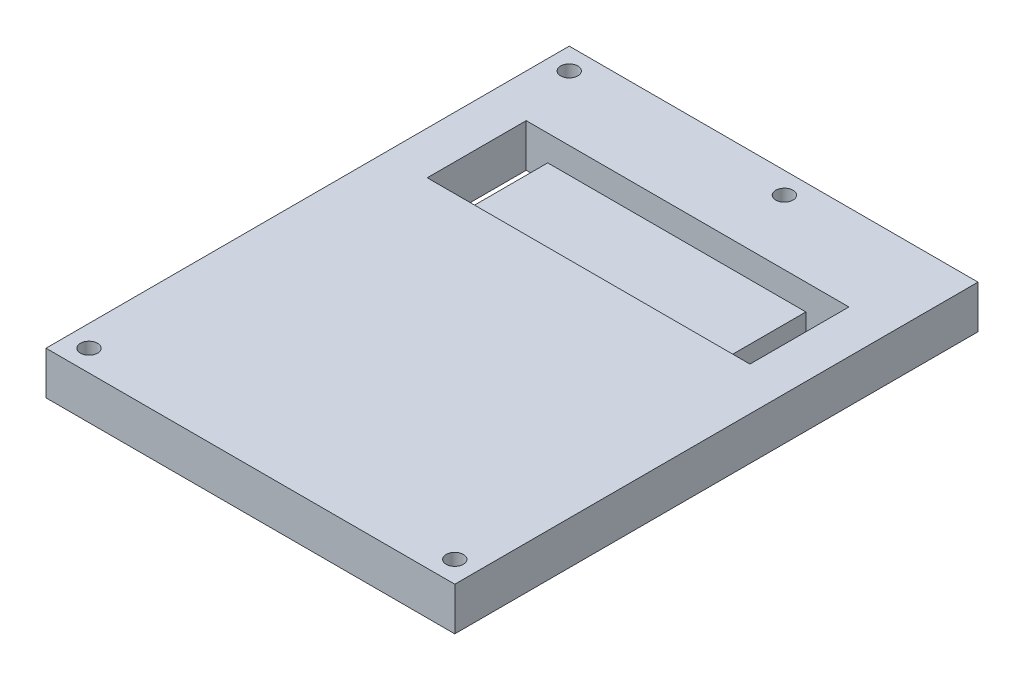
ISO-10303-21;
HEADER;
FILE_DESCRIPTION(('STEP AP214'),'2;1');
FILE_NAME('part.step','',(''),(''),'','','');
FILE_SCHEMA(('AUTOMOTIVE_DESIGN { 1 0 10303 214 1 1 1 1 }'));
ENDSEC;
DATA;
#1=APPLICATION_CONTEXT('core data for automotive mechanical design processes');
#2=APPLICATION_PROTOCOL_DEFINITION('international standard','automotive_design',2000,#1);
#3=PRODUCT_CONTEXT('',#1,'mechanical');
#4=PRODUCT('Part','Part','',(#3));
#5=PRODUCT_RELATED_PRODUCT_CATEGORY('part','',(#4));
#6=PRODUCT_DEFINITION_FORMATION('','',#4);
#7=PRODUCT_DEFINITION_CONTEXT('part definition',#1,'design');
#8=PRODUCT_DEFINITION('design','',#6,#7);
#9=PRODUCT_DEFINITION_SHAPE('','',#8);
#10=(LENGTH_UNIT() NAMED_UNIT(*) SI_UNIT(.MILLI.,.METRE.));
#11=(NAMED_UNIT(*) PLANE_ANGLE_UNIT() SI_UNIT($,.RADIAN.));
#12=(NAMED_UNIT(*) SI_UNIT($,.STERADIAN.) SOLID_ANGLE_UNIT());
#13=UNCERTAINTY_MEASURE_WITH_UNIT(LENGTH_MEASURE(1.E-05),#10,'distance_accuracy_value','');
#14=(GEOMETRIC_REPRESENTATION_CONTEXT(3) GLOBAL_UNCERTAINTY_ASSIGNED_CONTEXT((#13)) GLOBAL_UNIT_ASSIGNED_CONTEXT((#10,
#11,#12)) REPRESENTATION_CONTEXT('',''));
#15=CARTESIAN_POINT('',(0.,0.,0.));
#16=DIRECTION('',(0.,0.,1.));
#17=DIRECTION('',(1.,0.,0.));
#18=AXIS2_PLACEMENT_3D('',#15,#16,#17);
#19=CARTESIAN_POINT('',(0.,-3.,0.));
#20=DIRECTION('',(0.,-1.,0.));
#21=DIRECTION('',(0.,0.,-1.));
#22=AXIS2_PLACEMENT_3D('',#19,#20,#21);
#23=PLANE('',#22);
#24=DIRECTION('',(0.,0.,-1.));
#25=VECTOR('',#24,1.);
#26=CARTESIAN_POINT('',(-46.9052863436124,-3.,-23.3382371267091));
#27=LINE('',#26,#25);
#28=CARTESIAN_POINT('',(-46.9052863436124,-3.,-11.8382371267091));
#29=VERTEX_POINT('',#28);
#30=CARTESIAN_POINT('',(-46.9052863436124,-3.,-23.3382371267091));
#31=VERTEX_POINT('',#30);
#32=EDGE_CURVE('E161',#29,#31,#27,.T.);
#33=ORIENTED_EDGE('',*,*,#32,.F.);
#34=DIRECTION('',(1.,0.,0.));
#35=VECTOR('',#34,1.);
#36=CARTESIAN_POINT('',(-49.4052863436124,-3.,-11.8382371267091));
#37=LINE('',#36,#35);
#38=CARTESIAN_POINT('',(-16.9052863436124,-3.,-11.8382371267091));
#39=VERTEX_POINT('',#38);
#40=EDGE_CURVE('E208',#29,#39,#37,.T.);
#41=ORIENTED_EDGE('',*,*,#40,.T.);
#42=DIRECTION('',(0.,0.,1.));
#43=VECTOR('',#42,1.);
#44=CARTESIAN_POINT('',(-16.9052863436124,-3.,-23.3382371267091));
#45=LINE('',#44,#43);
#46=CARTESIAN_POINT('',(-16.9052863436124,-3.,-23.3382371267091));
#47=VERTEX_POINT('',#46);
#48=EDGE_CURVE('E185',#47,#39,#45,.T.);
#49=ORIENTED_EDGE('',*,*,#48,.F.);
#50=DIRECTION('',(1.,0.,0.));
#51=VECTOR('',#50,1.);
#52=CARTESIAN_POINT('',(-49.4052863436124,-3.,-23.3382371267091));
#53=LINE('',#52,#51);
#54=EDGE_CURVE('E204',#31,#47,#53,.T.);
#55=ORIENTED_EDGE('',*,*,#54,.F.);
#56=EDGE_LOOP('',(#33,#41,#49,#55));
#57=FACE_BOUND('',#56,.T.);
#58=ADVANCED_FACE('F39',(#57),#23,.F.);
#59=CARTESIAN_POINT('',(0.,0.,0.));
#60=DIRECTION('',(0.,-1.,0.));
#61=DIRECTION('',(0.,0.,-1.));
#62=AXIS2_PLACEMENT_3D('',#59,#60,#61);
#63=PLANE('',#62);
#64=CARTESIAN_POINT('',(-9.40528634361236,0.,24.9617628732909));
#65=DIRECTION('',(0.,1.,0.));
#66=DIRECTION('',(0.,0.,1.));
#67=AXIS2_PLACEMENT_3D('',#64,#65,#66);
#68=CIRCLE('',#67,1.);
#69=CARTESIAN_POINT('',(-9.40528634361236,0.,25.9617628732909));
#70=VERTEX_POINT('',#69);
#71=EDGE_CURVE('E462',#70,#70,#68,.T.);
#72=ORIENTED_EDGE('',*,*,#71,.F.);
#73=EDGE_LOOP('',(#72));
#74=FACE_BOUND('',#73,.T.);
#75=CARTESIAN_POINT('',(-51.9052863436124,0.,24.9617628732909));
#76=DIRECTION('',(0.,1.,0.));
#77=DIRECTION('',(0.,0.,1.));
#78=AXIS2_PLACEMENT_3D('',#75,#76,#77);
#79=CIRCLE('',#78,0.999999999999998);
#80=CARTESIAN_POINT('',(-51.9052863436124,0.,25.9617628732909));
#81=VERTEX_POINT('',#80);
#82=EDGE_CURVE('E470',#81,#81,#79,.T.);
#83=ORIENTED_EDGE('',*,*,#82,.F.);
#84=EDGE_LOOP('',(#83));
#85=FACE_BOUND('',#84,.T.);
#86=CARTESIAN_POINT('',(-51.9052863436124,0.,-30.8382371267091));
#87=DIRECTION('',(0.,1.,0.));
#88=DIRECTION('',(0.,0.,1.));
#89=AXIS2_PLACEMENT_3D('',#86,#87,#88);
#90=CIRCLE('',#89,0.999999999999998);
#91=CARTESIAN_POINT('',(-51.9052863436124,0.,-29.8382371267091));
#92=VERTEX_POINT('',#91);
#93=EDGE_CURVE('E480',#92,#92,#90,.T.);
#94=ORIENTED_EDGE('',*,*,#93,.F.);
#95=EDGE_LOOP('',(#94));
#96=FACE_BOUND('',#95,.T.);
#97=CARTESIAN_POINT('',(-26.9052863436124,0.,-30.8382371267091));
#98=DIRECTION('',(0.,1.,0.));
#99=DIRECTION('',(0.,0.,1.));
#100=AXIS2_PLACEMENT_3D('',#97,#98,#99);
#101=CIRCLE('',#100,1.);
#102=CARTESIAN_POINT('',(-26.9052863436124,0.,-29.8382371267091));
#103=VERTEX_POINT('',#102);
#104=EDGE_CURVE('E167',#103,#103,#101,.T.);
#105=ORIENTED_EDGE('',*,*,#104,.F.);
#106=EDGE_LOOP('',(#105));
#107=FACE_BOUND('',#106,.T.);
#108=DIRECTION('',(1.,0.,0.));
#109=VECTOR('',#108,1.);
#110=CARTESIAN_POINT('',(-54.4052863436124,0.,-33.3382371267091));
#111=LINE('',#110,#109);
#112=CARTESIAN_POINT('',(-54.4052863436124,0.,-33.3382371267091));
#113=VERTEX_POINT('',#112);
#114=CARTESIAN_POINT('',(-6.90528634361236,0.,-33.3382371267091));
#115=VERTEX_POINT('',#114);
#116=EDGE_CURVE('E232',#113,#115,#111,.T.);
#117=ORIENTED_EDGE('',*,*,#116,.F.);
#118=DIRECTION('',(0.,0.,1.));
#119=VECTOR('',#118,1.);
#120=CARTESIAN_POINT('',(-54.4052863436124,0.,-33.3382371267091));
#121=LINE('',#120,#119);
#122=CARTESIAN_POINT('',(-54.4052863436124,0.,27.4617628732909));
#123=VERTEX_POINT('',#122);
#124=EDGE_CURVE('E238',#113,#123,#121,.T.);
#125=ORIENTED_EDGE('',*,*,#124,.T.);
#126=DIRECTION('',(1.,0.,0.));
#127=VECTOR('',#126,1.);
#128=CARTESIAN_POINT('',(-54.4052863436124,0.,27.4617628732909));
#129=LINE('',#128,#127);
#130=CARTESIAN_POINT('',(-6.90528634361235,0.,27.4617628732909));
#131=VERTEX_POINT('',#130);
#132=EDGE_CURVE('E257',#123,#131,#129,.T.);
#133=ORIENTED_EDGE('',*,*,#132,.T.);
#134=DIRECTION('',(0.,0.,1.));
#135=VECTOR('',#134,1.);
#136=CARTESIAN_POINT('',(-6.90528634361236,0.,-33.3382371267091));
#137=LINE('',#136,#135);
#138=EDGE_CURVE('E253',#115,#131,#137,.T.);
#139=ORIENTED_EDGE('',*,*,#138,.F.);
#140=EDGE_LOOP('',(#117,#125,#133,#139));
#141=FACE_BOUND('',#140,.T.);
#142=DIRECTION('',(1.,0.,0.));
#143=VECTOR('',#142,1.);
#144=CARTESIAN_POINT('',(-49.4052863436124,0.,-23.3382371267091));
#145=LINE('',#144,#143);
#146=CARTESIAN_POINT('',(-49.4052863436124,0.,-23.3382371267091));
#147=VERTEX_POINT('',#146);
#148=CARTESIAN_POINT('',(-11.9052863436124,0.,-23.3382371267091));
#149=VERTEX_POINT('',#148);
#150=EDGE_CURVE('E177',#147,#149,#145,.T.);
#151=ORIENTED_EDGE('',*,*,#150,.T.);
#152=DIRECTION('',(0.,0.,1.));
#153=VECTOR('',#152,1.);
#154=CARTESIAN_POINT('',(-11.9052863436124,0.,-23.3382371267091));
#155=LINE('',#154,#153);
#156=CARTESIAN_POINT('',(-11.9052863436124,0.,-11.8382371267091));
#157=VERTEX_POINT('',#156);
#158=EDGE_CURVE('E215',#149,#157,#155,.T.);
#159=ORIENTED_EDGE('',*,*,#158,.T.);
#160=DIRECTION('',(1.,0.,0.));
#161=VECTOR('',#160,1.);
#162=CARTESIAN_POINT('',(-49.4052863436124,0.,-11.8382371267091));
#163=LINE('',#162,#161);
#164=CARTESIAN_POINT('',(-49.4052863436124,0.,-11.8382371267091));
#165=VERTEX_POINT('',#164);
#166=EDGE_CURVE('E219',#165,#157,#163,.T.);
#167=ORIENTED_EDGE('',*,*,#166,.F.);
#168=DIRECTION('',(0.,0.,1.));
#169=VECTOR('',#168,1.);
#170=CARTESIAN_POINT('',(-49.4052863436124,0.,-23.3382371267091));
#171=LINE('',#170,#169);
#172=EDGE_CURVE('E139',#147,#165,#171,.T.);
#173=ORIENTED_EDGE('',*,*,#172,.F.);
#174=EDGE_LOOP('',(#151,#159,#167,#173));
#175=FACE_BOUND('',#174,.T.);
#176=ADVANCED_FACE('F279',(#74,#85,#96,#107,#141,#175),#63,.F.);
#177=CARTESIAN_POINT('',(-54.4052863436124,-5.,-33.3382371267091));
#178=DIRECTION('',(0.,0.,1.));
#179=DIRECTION('',(1.,0.,0.));
#180=AXIS2_PLACEMENT_3D('',#177,#178,#179);
#181=PLANE('',#180);
#182=ORIENTED_EDGE('',*,*,#116,.T.);
#183=DIRECTION('',(0.,1.,0.));
#184=VECTOR('',#183,1.);
#185=CARTESIAN_POINT('',(-6.90528634361236,-5.,-33.3382371267091));
#186=LINE('',#185,#184);
#187=CARTESIAN_POINT('',(-6.90528634361236,-5.,-33.3382371267091));
#188=VERTEX_POINT('',#187);
#189=EDGE_CURVE('E11',#188,#115,#186,.T.);
#190=ORIENTED_EDGE('',*,*,#189,.F.);
#191=DIRECTION('',(1.,0.,0.));
#192=VECTOR('',#191,1.);
#193=CARTESIAN_POINT('',(-54.4052863436124,-5.,-33.3382371267091));
#194=LINE('',#193,#192);
#195=CARTESIAN_POINT('',(-54.4052863436124,-5.,-33.3382371267091));
#196=VERTEX_POINT('',#195);
#197=EDGE_CURVE('E233',#196,#188,#194,.T.);
#198=ORIENTED_EDGE('',*,*,#197,.F.);
#199=DIRECTION('',(0.,1.,0.));
#200=VECTOR('',#199,1.);
#201=CARTESIAN_POINT('',(-54.4052863436124,-5.,-33.3382371267091));
#202=LINE('',#201,#200);
#203=EDGE_CURVE('E249',#196,#113,#202,.T.);
#204=ORIENTED_EDGE('',*,*,#203,.T.);
#205=EDGE_LOOP('',(#182,#190,#198,#204));
#206=FACE_BOUND('',#205,.T.);
#207=ADVANCED_FACE('F41',(#206),#181,.F.);
#208=CARTESIAN_POINT('',(-6.90528634361236,-5.,-33.3382371267091));
#209=DIRECTION('',(-1.,0.,0.));
#210=DIRECTION('',(0.,0.,1.));
#211=AXIS2_PLACEMENT_3D('',#208,#209,#210);
#212=PLANE('',#211);
#213=ORIENTED_EDGE('',*,*,#138,.T.);
#214=DIRECTION('',(0.,1.,0.));
#215=VECTOR('',#214,1.);
#216=CARTESIAN_POINT('',(-6.90528634361235,-5.,27.4617628732909));
#217=LINE('',#216,#215);
#218=CARTESIAN_POINT('',(-6.90528634361235,-5.,27.4617628732909));
#219=VERTEX_POINT('',#218);
#220=EDGE_CURVE('E48',#219,#131,#217,.T.);
#221=ORIENTED_EDGE('',*,*,#220,.F.);
#222=DIRECTION('',(0.,0.,1.));
#223=VECTOR('',#222,1.);
#224=CARTESIAN_POINT('',(-6.90528634361236,-5.,-33.3382371267091));
#225=LINE('',#224,#223);
#226=EDGE_CURVE('E237',#188,#219,#225,.T.);
#227=ORIENTED_EDGE('',*,*,#226,.F.);
#228=ORIENTED_EDGE('',*,*,#189,.T.);
#229=EDGE_LOOP('',(#213,#221,#227,#228));
#230=FACE_BOUND('',#229,.T.);
#231=ADVANCED_FACE('F275',(#230),#212,.F.);
#232=CARTESIAN_POINT('',(-54.4052863436124,-5.,27.4617628732909));
#233=DIRECTION('',(0.,0.,1.));
#234=DIRECTION('',(1.,0.,0.));
#235=AXIS2_PLACEMENT_3D('',#232,#233,#234);
#236=PLANE('',#235);
#237=ORIENTED_EDGE('',*,*,#132,.F.);
#238=DIRECTION('',(0.,1.,0.));
#239=VECTOR('',#238,1.);
#240=CARTESIAN_POINT('',(-54.4052863436124,-5.,27.4617628732909));
#241=LINE('',#240,#239);
#242=CARTESIAN_POINT('',(-54.4052863436124,-5.,27.4617628732909));
#243=VERTEX_POINT('',#242);
#244=EDGE_CURVE('E266',#243,#123,#241,.T.);
#245=ORIENTED_EDGE('',*,*,#244,.F.);
#246=DIRECTION('',(1.,0.,0.));
#247=VECTOR('',#246,1.);
#248=CARTESIAN_POINT('',(-54.4052863436124,-5.,27.4617628732909));
#249=LINE('',#248,#247);
#250=EDGE_CURVE('E241',#243,#219,#249,.T.);
#251=ORIENTED_EDGE('',*,*,#250,.T.);
#252=ORIENTED_EDGE('',*,*,#220,.T.);
#253=EDGE_LOOP('',(#237,#245,#251,#252));
#254=FACE_BOUND('',#253,.T.);
#255=ADVANCED_FACE('F272',(#254),#236,.T.);
#256=CARTESIAN_POINT('',(-54.4052863436124,-5.,-33.3382371267091));
#257=DIRECTION('',(-1.,0.,0.));
#258=DIRECTION('',(0.,0.,1.));
#259=AXIS2_PLACEMENT_3D('',#256,#257,#258);
#260=PLANE('',#259);
#261=ORIENTED_EDGE('',*,*,#124,.F.);
#262=ORIENTED_EDGE('',*,*,#203,.F.);
#263=DIRECTION('',(0.,0.,1.));
#264=VECTOR('',#263,1.);
#265=CARTESIAN_POINT('',(-54.4052863436124,-5.,-33.3382371267091));
#266=LINE('',#265,#264);
#267=EDGE_CURVE('E245',#196,#243,#266,.T.);
#268=ORIENTED_EDGE('',*,*,#267,.T.);
#269=ORIENTED_EDGE('',*,*,#244,.T.);
#270=EDGE_LOOP('',(#261,#262,#268,#269));
#271=FACE_BOUND('',#270,.T.);
#272=ADVANCED_FACE('F283',(#271),#260,.T.);
#273=CARTESIAN_POINT('',(0.,-5.,0.));
#274=DIRECTION('',(0.,-1.,0.));
#275=DIRECTION('',(0.,0.,-1.));
#276=AXIS2_PLACEMENT_3D('',#273,#274,#275);
#277=PLANE('',#276);
#278=CARTESIAN_POINT('',(-9.40528634361236,-5.,24.9617628732909));
#279=DIRECTION('',(0.,1.,0.));
#280=DIRECTION('',(0.,0.,1.));
#281=AXIS2_PLACEMENT_3D('',#278,#279,#280);
#282=CIRCLE('',#281,1.);
#283=CARTESIAN_POINT('',(-9.40528634361236,-5.,25.9617628732909));
#284=VERTEX_POINT('',#283);
#285=EDGE_CURVE('E199',#284,#284,#282,.T.);
#286=ORIENTED_EDGE('',*,*,#285,.T.);
#287=EDGE_LOOP('',(#286));
#288=FACE_BOUND('',#287,.T.);
#289=CARTESIAN_POINT('',(-51.9052863436124,-5.,24.9617628732909));
#290=DIRECTION('',(0.,1.,0.));
#291=DIRECTION('',(0.,0.,1.));
#292=AXIS2_PLACEMENT_3D('',#289,#290,#291);
#293=CIRCLE('',#292,0.999999999999998);
#294=CARTESIAN_POINT('',(-51.9052863436124,-5.,25.9617628732909));
#295=VERTEX_POINT('',#294);
#296=EDGE_CURVE('E464',#295,#295,#293,.T.);
#297=ORIENTED_EDGE('',*,*,#296,.T.);
#298=EDGE_LOOP('',(#297));
#299=FACE_BOUND('',#298,.T.);
#300=CARTESIAN_POINT('',(-51.9052863436124,-5.,-30.8382371267091));
#301=DIRECTION('',(0.,1.,0.));
#302=DIRECTION('',(0.,0.,1.));
#303=AXIS2_PLACEMENT_3D('',#300,#301,#302);
#304=CIRCLE('',#303,0.999999999999998);
#305=CARTESIAN_POINT('',(-51.9052863436124,-5.,-29.8382371267091));
#306=VERTEX_POINT('',#305);
#307=EDGE_CURVE('E476',#306,#306,#304,.T.);
#308=ORIENTED_EDGE('',*,*,#307,.T.);
#309=EDGE_LOOP('',(#308));
#310=FACE_BOUND('',#309,.T.);
#311=CARTESIAN_POINT('',(-26.9052863436124,-5.,-30.8382371267091));
#312=DIRECTION('',(0.,1.,0.));
#313=DIRECTION('',(0.,0.,1.));
#314=AXIS2_PLACEMENT_3D('',#311,#312,#313);
#315=CIRCLE('',#314,1.);
#316=CARTESIAN_POINT('',(-26.9052863436124,-5.,-29.8382371267091));
#317=VERTEX_POINT('',#316);
#318=EDGE_CURVE('E483',#317,#317,#315,.T.);
#319=ORIENTED_EDGE('',*,*,#318,.T.);
#320=EDGE_LOOP('',(#319));
#321=FACE_BOUND('',#320,.T.);
#322=DIRECTION('',(0.,0.,1.));
#323=VECTOR('',#322,1.);
#324=CARTESIAN_POINT('',(-49.4052863436124,-5.,-23.3382371267091));
#325=LINE('',#324,#323);
#326=CARTESIAN_POINT('',(-49.4052863436124,-5.,-23.3382371267091));
#327=VERTEX_POINT('',#326);
#328=CARTESIAN_POINT('',(-49.4052863436124,-5.,-11.8382371267091));
#329=VERTEX_POINT('',#328);
#330=EDGE_CURVE('E136',#327,#329,#325,.T.);
#331=ORIENTED_EDGE('',*,*,#330,.T.);
#332=DIRECTION('',(1.,0.,0.));
#333=VECTOR('',#332,1.);
#334=CARTESIAN_POINT('',(-49.4052863436124,-5.,-11.8382371267091));
#335=LINE('',#334,#333);
#336=CARTESIAN_POINT('',(-46.9052863436124,-5.,-11.8382371267091));
#337=VERTEX_POINT('',#336);
#338=EDGE_CURVE('E148',#329,#337,#335,.T.);
#339=ORIENTED_EDGE('',*,*,#338,.T.);
#340=DIRECTION('',(0.,0.,-1.));
#341=VECTOR('',#340,1.);
#342=CARTESIAN_POINT('',(-46.9052863436124,-5.,-23.3382371267091));
#343=LINE('',#342,#341);
#344=CARTESIAN_POINT('',(-46.9052863436124,-5.,-23.3382371267091));
#345=VERTEX_POINT('',#344);
#346=EDGE_CURVE('E154',#337,#345,#343,.T.);
#347=ORIENTED_EDGE('',*,*,#346,.T.);
#348=DIRECTION('',(-1.,0.,0.));
#349=VECTOR('',#348,1.);
#350=CARTESIAN_POINT('',(-49.4052863436124,-5.,-23.3382371267091));
#351=LINE('',#350,#349);
#352=EDGE_CURVE('E159',#345,#327,#351,.T.);
#353=ORIENTED_EDGE('',*,*,#352,.T.);
#354=EDGE_LOOP('',(#331,#339,#347,#353));
#355=FACE_BOUND('',#354,.T.);
#356=DIRECTION('',(0.,0.,-1.));
#357=VECTOR('',#356,1.);
#358=CARTESIAN_POINT('',(-11.9052863436124,-5.,-23.3382371267091));
#359=LINE('',#358,#357);
#360=CARTESIAN_POINT('',(-11.9052863436124,-5.,-11.8382371267091));
#361=VERTEX_POINT('',#360);
#362=CARTESIAN_POINT('',(-11.9052863436124,-5.,-23.3382371267091));
#363=VERTEX_POINT('',#362);
#364=EDGE_CURVE('E180',#361,#363,#359,.T.);
#365=ORIENTED_EDGE('',*,*,#364,.T.);
#366=DIRECTION('',(-1.,0.,0.));
#367=VECTOR('',#366,1.);
#368=CARTESIAN_POINT('',(-11.9052863436124,-5.,-23.3382371267091));
#369=LINE('',#368,#367);
#370=CARTESIAN_POINT('',(-16.9052863436124,-5.,-23.3382371267091));
#371=VERTEX_POINT('',#370);
#372=EDGE_CURVE('E184',#363,#371,#369,.T.);
#373=ORIENTED_EDGE('',*,*,#372,.T.);
#374=DIRECTION('',(0.,0.,1.));
#375=VECTOR('',#374,1.);
#376=CARTESIAN_POINT('',(-16.9052863436124,-5.,-23.3382371267091));
#377=LINE('',#376,#375);
#378=CARTESIAN_POINT('',(-16.9052863436124,-5.,-11.8382371267091));
#379=VERTEX_POINT('',#378);
#380=EDGE_CURVE('E189',#371,#379,#377,.T.);
#381=ORIENTED_EDGE('',*,*,#380,.T.);
#382=DIRECTION('',(1.,0.,0.));
#383=VECTOR('',#382,1.);
#384=CARTESIAN_POINT('',(-11.9052863436124,-5.,-11.8382371267091));
#385=LINE('',#384,#383);
#386=EDGE_CURVE('E193',#379,#361,#385,.T.);
#387=ORIENTED_EDGE('',*,*,#386,.T.);
#388=EDGE_LOOP('',(#365,#373,#381,#387));
#389=FACE_BOUND('',#388,.T.);
#390=ORIENTED_EDGE('',*,*,#197,.T.);
#391=ORIENTED_EDGE('',*,*,#226,.T.);
#392=ORIENTED_EDGE('',*,*,#250,.F.);
#393=ORIENTED_EDGE('',*,*,#267,.F.);
#394=EDGE_LOOP('',(#390,#391,#392,#393));
#395=FACE_BOUND('',#394,.T.);
#396=ADVANCED_FACE('F156',(#288,#299,#310,#321,#355,#389,#395),#277,.T.);
#397=CARTESIAN_POINT('',(-49.4052863436124,-3.,-23.3382371267091));
#398=DIRECTION('',(0.,0.,1.));
#399=DIRECTION('',(1.,0.,0.));
#400=AXIS2_PLACEMENT_3D('',#397,#398,#399);
#401=PLANE('',#400);
#402=ORIENTED_EDGE('',*,*,#150,.F.);
#403=DIRECTION('',(0.,1.,0.));
#404=VECTOR('',#403,1.);
#405=CARTESIAN_POINT('',(-49.4052863436124,-3.,-23.3382371267091));
#406=LINE('',#405,#404);
#407=EDGE_CURVE('E145',#327,#147,#406,.T.);
#408=ORIENTED_EDGE('',*,*,#407,.F.);
#409=ORIENTED_EDGE('',*,*,#352,.F.);
#410=DIRECTION('',(0.,1.,0.));
#411=VECTOR('',#410,1.);
#412=CARTESIAN_POINT('',(-46.9052863436124,-5.,-23.3382371267091));
#413=LINE('',#412,#411);
#414=EDGE_CURVE('E174',#345,#31,#413,.T.);
#415=ORIENTED_EDGE('',*,*,#414,.T.);
#416=ORIENTED_EDGE('',*,*,#54,.T.);
#417=DIRECTION('',(0.,1.,0.));
#418=VECTOR('',#417,1.);
#419=CARTESIAN_POINT('',(-16.9052863436124,-5.,-23.3382371267091));
#420=LINE('',#419,#418);
#421=EDGE_CURVE('E63',#371,#47,#420,.T.);
#422=ORIENTED_EDGE('',*,*,#421,.F.);
#423=ORIENTED_EDGE('',*,*,#372,.F.);
#424=DIRECTION('',(0.,1.,0.));
#425=VECTOR('',#424,1.);
#426=CARTESIAN_POINT('',(-11.9052863436124,-3.,-23.3382371267091));
#427=LINE('',#426,#425);
#428=EDGE_CURVE('E228',#363,#149,#427,.T.);
#429=ORIENTED_EDGE('',*,*,#428,.T.);
#430=EDGE_LOOP('',(#402,#408,#409,#415,#416,#422,#423,#429));
#431=FACE_BOUND('',#430,.T.);
#432=ADVANCED_FACE('F311',(#431),#401,.T.);
#433=CARTESIAN_POINT('',(-11.9052863436124,-3.,-23.3382371267091));
#434=DIRECTION('',(-1.,0.,0.));
#435=DIRECTION('',(0.,0.,1.));
#436=AXIS2_PLACEMENT_3D('',#433,#434,#435);
#437=PLANE('',#436);
#438=ORIENTED_EDGE('',*,*,#158,.F.);
#439=ORIENTED_EDGE('',*,*,#428,.F.);
#440=ORIENTED_EDGE('',*,*,#364,.F.);
#441=DIRECTION('',(0.,1.,0.));
#442=VECTOR('',#441,1.);
#443=CARTESIAN_POINT('',(-11.9052863436124,-3.,-11.8382371267091));
#444=LINE('',#443,#442);
#445=EDGE_CURVE('E144',#361,#157,#444,.T.);
#446=ORIENTED_EDGE('',*,*,#445,.T.);
#447=EDGE_LOOP('',(#438,#439,#440,#446));
#448=FACE_BOUND('',#447,.T.);
#449=ADVANCED_FACE('F308',(#448),#437,.T.);
#450=CARTESIAN_POINT('',(-49.4052863436124,-3.,-11.8382371267091));
#451=DIRECTION('',(0.,0.,1.));
#452=DIRECTION('',(1.,0.,0.));
#453=AXIS2_PLACEMENT_3D('',#450,#451,#452);
#454=PLANE('',#453);
#455=ORIENTED_EDGE('',*,*,#166,.T.);
#456=ORIENTED_EDGE('',*,*,#445,.F.);
#457=ORIENTED_EDGE('',*,*,#386,.F.);
#458=DIRECTION('',(0.,1.,0.));
#459=VECTOR('',#458,1.);
#460=CARTESIAN_POINT('',(-16.9052863436124,-5.,-11.8382371267091));
#461=LINE('',#460,#459);
#462=EDGE_CURVE('E164',#379,#39,#461,.T.);
#463=ORIENTED_EDGE('',*,*,#462,.T.);
#464=ORIENTED_EDGE('',*,*,#40,.F.);
#465=DIRECTION('',(0.,1.,0.));
#466=VECTOR('',#465,1.);
#467=CARTESIAN_POINT('',(-46.9052863436124,-5.,-11.8382371267091));
#468=LINE('',#467,#466);
#469=EDGE_CURVE('E55',#337,#29,#468,.T.);
#470=ORIENTED_EDGE('',*,*,#469,.F.);
#471=ORIENTED_EDGE('',*,*,#338,.F.);
#472=DIRECTION('',(0.,1.,0.));
#473=VECTOR('',#472,1.);
#474=CARTESIAN_POINT('',(-49.4052863436124,-3.,-11.8382371267091));
#475=LINE('',#474,#473);
#476=EDGE_CURVE('E131',#329,#165,#475,.T.);
#477=ORIENTED_EDGE('',*,*,#476,.T.);
#478=EDGE_LOOP('',(#455,#456,#457,#463,#464,#470,#471,#477));
#479=FACE_BOUND('',#478,.T.);
#480=ADVANCED_FACE('F149',(#479),#454,.F.);
#481=CARTESIAN_POINT('',(-49.4052863436124,-3.,-23.3382371267091));
#482=DIRECTION('',(-1.,0.,0.));
#483=DIRECTION('',(0.,0.,1.));
#484=AXIS2_PLACEMENT_3D('',#481,#482,#483);
#485=PLANE('',#484);
#486=ORIENTED_EDGE('',*,*,#172,.T.);
#487=ORIENTED_EDGE('',*,*,#476,.F.);
#488=ORIENTED_EDGE('',*,*,#330,.F.);
#489=ORIENTED_EDGE('',*,*,#407,.T.);
#490=EDGE_LOOP('',(#486,#487,#488,#489));
#491=FACE_BOUND('',#490,.T.);
#492=ADVANCED_FACE('F133',(#491),#485,.F.);
#493=CARTESIAN_POINT('',(-16.9052863436124,-5.,-23.3382371267091));
#494=DIRECTION('',(-1.,0.,0.));
#495=DIRECTION('',(0.,0.,1.));
#496=AXIS2_PLACEMENT_3D('',#493,#494,#495);
#497=PLANE('',#496);
#498=ORIENTED_EDGE('',*,*,#48,.T.);
#499=ORIENTED_EDGE('',*,*,#462,.F.);
#500=ORIENTED_EDGE('',*,*,#380,.F.);
#501=ORIENTED_EDGE('',*,*,#421,.T.);
#502=EDGE_LOOP('',(#498,#499,#500,#501));
#503=FACE_BOUND('',#502,.T.);
#504=ADVANCED_FACE('F302',(#503),#497,.F.);
#505=CARTESIAN_POINT('',(-46.9052863436124,-5.,-23.3382371267091));
#506=DIRECTION('',(1.,0.,0.));
#507=DIRECTION('',(0.,0.,-1.));
#508=AXIS2_PLACEMENT_3D('',#505,#506,#507);
#509=PLANE('',#508);
#510=ORIENTED_EDGE('',*,*,#32,.T.);
#511=ORIENTED_EDGE('',*,*,#414,.F.);
#512=ORIENTED_EDGE('',*,*,#346,.F.);
#513=ORIENTED_EDGE('',*,*,#469,.T.);
#514=EDGE_LOOP('',(#510,#511,#512,#513));
#515=FACE_BOUND('',#514,.T.);
#516=ADVANCED_FACE('F358',(#515),#509,.F.);
#517=CARTESIAN_POINT('',(-26.9052863436124,-5.,-30.8382371267091));
#518=DIRECTION('',(0.,1.,0.));
#519=DIRECTION('',(0.,0.,1.));
#520=AXIS2_PLACEMENT_3D('',#517,#518,#519);
#521=CYLINDRICAL_SURFACE('',#520,1.);
#522=ORIENTED_EDGE('',*,*,#318,.F.);
#523=EDGE_LOOP('',(#522));
#524=FACE_BOUND('',#523,.T.);
#525=ORIENTED_EDGE('',*,*,#104,.T.);
#526=EDGE_LOOP('',(#525));
#527=FACE_BOUND('',#526,.T.);
#528=ADVANCED_FACE('F364',(#524,#527),#521,.F.);
#529=CARTESIAN_POINT('',(-51.9052863436124,-5.,-30.8382371267091));
#530=DIRECTION('',(0.,1.,0.));
#531=DIRECTION('',(0.,0.,1.));
#532=AXIS2_PLACEMENT_3D('',#529,#530,#531);
#533=CYLINDRICAL_SURFACE('',#532,0.999999999999998);
#534=ORIENTED_EDGE('',*,*,#307,.F.);
#535=EDGE_LOOP('',(#534));
#536=FACE_BOUND('',#535,.T.);
#537=ORIENTED_EDGE('',*,*,#93,.T.);
#538=EDGE_LOOP('',(#537));
#539=FACE_BOUND('',#538,.T.);
#540=ADVANCED_FACE('F369',(#536,#539),#533,.F.);
#541=CARTESIAN_POINT('',(-51.9052863436124,-5.,24.9617628732909));
#542=DIRECTION('',(0.,1.,0.));
#543=DIRECTION('',(0.,0.,1.));
#544=AXIS2_PLACEMENT_3D('',#541,#542,#543);
#545=CYLINDRICAL_SURFACE('',#544,0.999999999999998);
#546=ORIENTED_EDGE('',*,*,#296,.F.);
#547=EDGE_LOOP('',(#546));
#548=FACE_BOUND('',#547,.T.);
#549=ORIENTED_EDGE('',*,*,#82,.T.);
#550=EDGE_LOOP('',(#549));
#551=FACE_BOUND('',#550,.T.);
#552=ADVANCED_FACE('F377',(#548,#551),#545,.F.);
#553=CARTESIAN_POINT('',(-9.40528634361236,-5.,24.9617628732909));
#554=DIRECTION('',(0.,1.,0.));
#555=DIRECTION('',(0.,0.,1.));
#556=AXIS2_PLACEMENT_3D('',#553,#554,#555);
#557=CYLINDRICAL_SURFACE('',#556,1.);
#558=ORIENTED_EDGE('',*,*,#285,.F.);
#559=EDGE_LOOP('',(#558));
#560=FACE_BOUND('',#559,.T.);
#561=ORIENTED_EDGE('',*,*,#71,.T.);
#562=EDGE_LOOP('',(#561));
#563=FACE_BOUND('',#562,.T.);
#564=ADVANCED_FACE('F385',(#560,#563),#557,.F.);
#565=CLOSED_SHELL('',(#58,#176,#207,#231,#255,#272,#396,#432,#449,#480,#492,#504,#516,#528,#540,
#552,#564));
#566=MANIFOLD_SOLID_BREP('B2',#565);
#567=ADVANCED_BREP_SHAPE_REPRESENTATION('',(#18,#566),#14);
#568=SHAPE_DEFINITION_REPRESENTATION(#9,#567);
ENDSEC;
END-ISO-10303-21;
